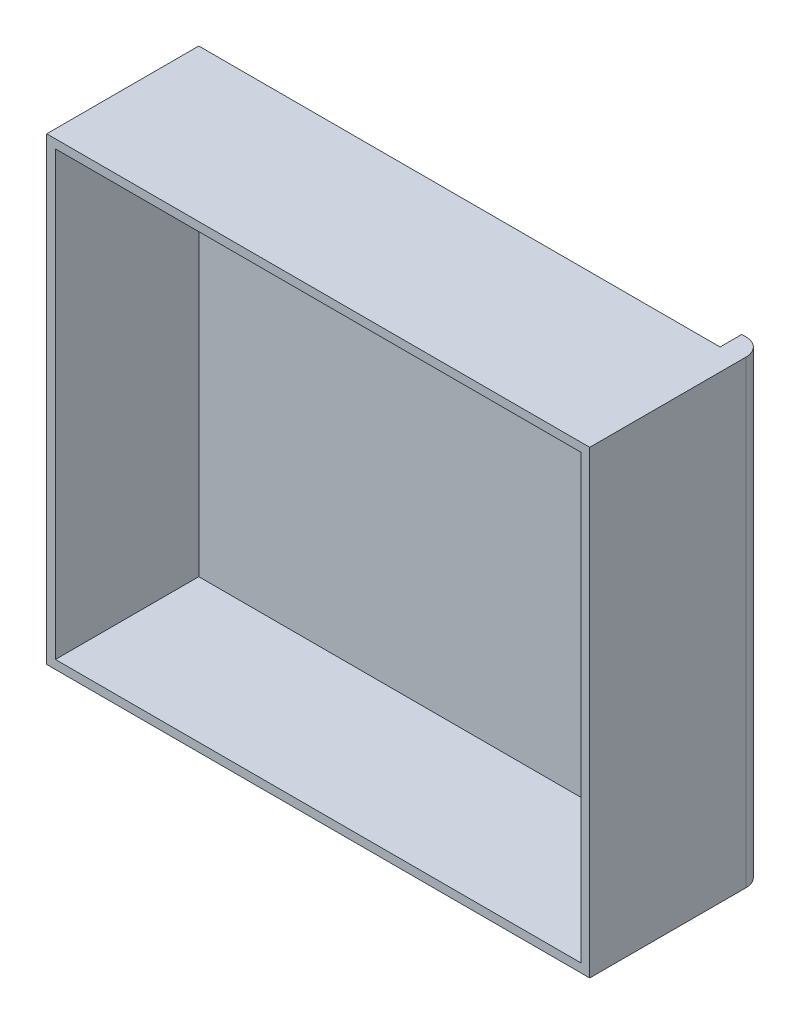
ISO-10303-21;
HEADER;
FILE_DESCRIPTION(('STEP AP214'),'2;1');
FILE_NAME('part.step','',(''),(''),'','','');
FILE_SCHEMA(('AUTOMOTIVE_DESIGN { 1 0 10303 214 1 1 1 1 }'));
ENDSEC;
DATA;
#1=APPLICATION_CONTEXT('core data for automotive mechanical design processes');
#2=APPLICATION_PROTOCOL_DEFINITION('international standard','automotive_design',2000,#1);
#3=PRODUCT_CONTEXT('',#1,'mechanical');
#4=PRODUCT('Part','Part','',(#3));
#5=PRODUCT_RELATED_PRODUCT_CATEGORY('part','',(#4));
#6=PRODUCT_DEFINITION_FORMATION('','',#4);
#7=PRODUCT_DEFINITION_CONTEXT('part definition',#1,'design');
#8=PRODUCT_DEFINITION('design','',#6,#7);
#9=PRODUCT_DEFINITION_SHAPE('','',#8);
#10=(LENGTH_UNIT() NAMED_UNIT(*) SI_UNIT(.MILLI.,.METRE.));
#11=(NAMED_UNIT(*) PLANE_ANGLE_UNIT() SI_UNIT($,.RADIAN.));
#12=(NAMED_UNIT(*) SI_UNIT($,.STERADIAN.) SOLID_ANGLE_UNIT());
#13=UNCERTAINTY_MEASURE_WITH_UNIT(LENGTH_MEASURE(1.E-05),#10,'distance_accuracy_value','');
#14=(GEOMETRIC_REPRESENTATION_CONTEXT(3) GLOBAL_UNCERTAINTY_ASSIGNED_CONTEXT((#13)) GLOBAL_UNIT_ASSIGNED_CONTEXT((#10,
#11,#12)) REPRESENTATION_CONTEXT('',''));
#15=CARTESIAN_POINT('',(0.,0.,0.));
#16=DIRECTION('',(0.,0.,1.));
#17=DIRECTION('',(1.,0.,0.));
#18=AXIS2_PLACEMENT_3D('',#15,#16,#17);
#19=CARTESIAN_POINT('',(0.,0.,35.));
#20=DIRECTION('',(0.,0.,-1.));
#21=DIRECTION('',(-1.,0.,0.));
#22=AXIS2_PLACEMENT_3D('',#19,#20,#21);
#23=PLANE('',#22);
#24=DIRECTION('',(0.,-1.,0.));
#25=VECTOR('',#24,1.);
#26=CARTESIAN_POINT('',(0.,0.,35.));
#27=LINE('',#26,#25);
#28=CARTESIAN_POINT('',(0.,105.8,35.));
#29=VERTEX_POINT('',#28);
#30=CARTESIAN_POINT('',(0.,0.,35.));
#31=VERTEX_POINT('',#30);
#32=EDGE_CURVE('E176',#29,#31,#27,.T.);
#33=ORIENTED_EDGE('',*,*,#32,.T.);
#34=DIRECTION('',(1.,0.,0.));
#35=VECTOR('',#34,1.);
#36=CARTESIAN_POINT('',(0.,0.,35.));
#37=LINE('',#36,#35);
#38=CARTESIAN_POINT('',(125.,0.,35.));
#39=VERTEX_POINT('',#38);
#40=EDGE_CURVE('E179',#31,#39,#37,.T.);
#41=ORIENTED_EDGE('',*,*,#40,.T.);
#42=DIRECTION('',(0.,1.,0.));
#43=VECTOR('',#42,1.);
#44=CARTESIAN_POINT('',(125.,0.,35.));
#45=LINE('',#44,#43);
#46=CARTESIAN_POINT('',(125.,105.8,35.));
#47=VERTEX_POINT('',#46);
#48=EDGE_CURVE('E182',#39,#47,#45,.T.);
#49=ORIENTED_EDGE('',*,*,#48,.T.);
#50=DIRECTION('',(-1.,0.,0.));
#51=VECTOR('',#50,1.);
#52=CARTESIAN_POINT('',(0.,105.8,35.));
#53=LINE('',#52,#51);
#54=EDGE_CURVE('E184',#47,#29,#53,.T.);
#55=ORIENTED_EDGE('',*,*,#54,.T.);
#56=EDGE_LOOP('',(#33,#41,#49,#55));
#57=FACE_BOUND('',#56,.T.);
#58=DIRECTION('',(0.,-1.,0.));
#59=VECTOR('',#58,1.);
#60=CARTESIAN_POINT('',(2.,0.,35.));
#61=LINE('',#60,#59);
#62=CARTESIAN_POINT('',(2.,103.8,35.));
#63=VERTEX_POINT('',#62);
#64=CARTESIAN_POINT('',(2.,2.,35.));
#65=VERTEX_POINT('',#64);
#66=EDGE_CURVE('E168',#63,#65,#61,.T.);
#67=ORIENTED_EDGE('',*,*,#66,.F.);
#68=DIRECTION('',(-1.,0.,0.));
#69=VECTOR('',#68,1.);
#70=CARTESIAN_POINT('',(0.,103.8,35.));
#71=LINE('',#70,#69);
#72=CARTESIAN_POINT('',(123.,103.8,35.));
#73=VERTEX_POINT('',#72);
#74=EDGE_CURVE('E158',#73,#63,#71,.T.);
#75=ORIENTED_EDGE('',*,*,#74,.F.);
#76=DIRECTION('',(0.,1.,0.));
#77=VECTOR('',#76,1.);
#78=CARTESIAN_POINT('',(123.,0.,35.));
#79=LINE('',#78,#77);
#80=CARTESIAN_POINT('',(123.,2.,35.));
#81=VERTEX_POINT('',#80);
#82=EDGE_CURVE('E172',#81,#73,#79,.T.);
#83=ORIENTED_EDGE('',*,*,#82,.F.);
#84=DIRECTION('',(1.,0.,0.));
#85=VECTOR('',#84,1.);
#86=CARTESIAN_POINT('',(0.,2.,35.));
#87=LINE('',#86,#85);
#88=EDGE_CURVE('E170',#65,#81,#87,.T.);
#89=ORIENTED_EDGE('',*,*,#88,.F.);
#90=EDGE_LOOP('',(#67,#75,#83,#89));
#91=FACE_BOUND('',#90,.T.);
#92=ADVANCED_FACE('F33',(#57,#91),#23,.F.);
#93=CARTESIAN_POINT('',(0.,0.,35.));
#94=DIRECTION('',(1.,0.,0.));
#95=DIRECTION('',(0.,0.,-1.));
#96=AXIS2_PLACEMENT_3D('',#93,#94,#95);
#97=PLANE('',#96);
#98=DIRECTION('',(0.,-1.,0.));
#99=VECTOR('',#98,1.);
#100=CARTESIAN_POINT('',(0.,0.,0.));
#101=LINE('',#100,#99);
#102=CARTESIAN_POINT('',(0.,105.8,0.));
#103=VERTEX_POINT('',#102);
#104=CARTESIAN_POINT('',(0.,0.,0.));
#105=VERTEX_POINT('',#104);
#106=EDGE_CURVE('E152',#103,#105,#101,.T.);
#107=ORIENTED_EDGE('',*,*,#106,.T.);
#108=DIRECTION('',(0.,0.,-1.));
#109=VECTOR('',#108,1.);
#110=CARTESIAN_POINT('',(0.,0.,35.));
#111=LINE('',#110,#109);
#112=EDGE_CURVE('E197',#31,#105,#111,.T.);
#113=ORIENTED_EDGE('',*,*,#112,.F.);
#114=ORIENTED_EDGE('',*,*,#32,.F.);
#115=DIRECTION('',(0.,0.,-1.));
#116=VECTOR('',#115,1.);
#117=CARTESIAN_POINT('',(0.,105.8,35.));
#118=LINE('',#117,#116);
#119=EDGE_CURVE('E186',#29,#103,#118,.T.);
#120=ORIENTED_EDGE('',*,*,#119,.T.);
#121=EDGE_LOOP('',(#107,#113,#114,#120));
#122=FACE_BOUND('',#121,.T.);
#123=ADVANCED_FACE('F204',(#122),#97,.F.);
#124=CARTESIAN_POINT('',(0.,0.,35.));
#125=DIRECTION('',(0.,1.,0.));
#126=DIRECTION('',(0.,0.,1.));
#127=AXIS2_PLACEMENT_3D('',#124,#125,#126);
#128=PLANE('',#127);
#129=DIRECTION('',(-1.,0.,0.));
#130=VECTOR('',#129,1.);
#131=CARTESIAN_POINT('',(125.,0.,-5.));
#132=LINE('',#131,#130);
#133=CARTESIAN_POINT('',(121.,0.,-5.));
#134=VERTEX_POINT('',#133);
#135=CARTESIAN_POINT('',(120.,0.,-5.));
#136=VERTEX_POINT('',#135);
#137=EDGE_CURVE('E115',#134,#136,#132,.T.);
#138=ORIENTED_EDGE('',*,*,#137,.F.);
#139=CARTESIAN_POINT('',(121.,0.,-1.));
#140=DIRECTION('',(0.,1.,0.));
#141=DIRECTION('',(0.,0.,1.));
#142=AXIS2_PLACEMENT_3D('',#139,#140,#141);
#143=CIRCLE('',#142,4.);
#144=CARTESIAN_POINT('',(125.,0.,-1.));
#145=VERTEX_POINT('',#144);
#146=EDGE_CURVE('E55',#134,#145,#143,.F.);
#147=ORIENTED_EDGE('',*,*,#146,.T.);
#148=DIRECTION('',(0.,0.,-1.));
#149=VECTOR('',#148,1.);
#150=CARTESIAN_POINT('',(125.,0.,35.));
#151=LINE('',#150,#149);
#152=EDGE_CURVE('E195',#39,#145,#151,.T.);
#153=ORIENTED_EDGE('',*,*,#152,.F.);
#154=ORIENTED_EDGE('',*,*,#40,.F.);
#155=ORIENTED_EDGE('',*,*,#112,.T.);
#156=DIRECTION('',(1.,0.,0.));
#157=VECTOR('',#156,1.);
#158=CARTESIAN_POINT('',(0.,0.,0.));
#159=LINE('',#158,#157);
#160=CARTESIAN_POINT('',(120.,0.,0.));
#161=VERTEX_POINT('',#160);
#162=EDGE_CURVE('E131',#105,#161,#159,.T.);
#163=ORIENTED_EDGE('',*,*,#162,.T.);
#164=DIRECTION('',(0.,0.,1.));
#165=VECTOR('',#164,1.);
#166=CARTESIAN_POINT('',(120.,0.,-5.));
#167=LINE('',#166,#165);
#168=EDGE_CURVE('E128',#136,#161,#167,.T.);
#169=ORIENTED_EDGE('',*,*,#168,.F.);
#170=EDGE_LOOP('',(#138,#147,#153,#154,#155,#163,#169));
#171=FACE_BOUND('',#170,.T.);
#172=ADVANCED_FACE('F129',(#171),#128,.F.);
#173=CARTESIAN_POINT('',(125.,0.,35.));
#174=DIRECTION('',(-1.,0.,0.));
#175=DIRECTION('',(0.,0.,1.));
#176=AXIS2_PLACEMENT_3D('',#173,#174,#175);
#177=PLANE('',#176);
#178=ORIENTED_EDGE('',*,*,#152,.T.);
#179=DIRECTION('',(0.,-1.,0.));
#180=VECTOR('',#179,1.);
#181=CARTESIAN_POINT('',(125.,105.8,-1.));
#182=LINE('',#181,#180);
#183=CARTESIAN_POINT('',(125.,105.8,-1.));
#184=VERTEX_POINT('',#183);
#185=EDGE_CURVE('E41',#145,#184,#182,.F.);
#186=ORIENTED_EDGE('',*,*,#185,.T.);
#187=DIRECTION('',(0.,0.,-1.));
#188=VECTOR('',#187,1.);
#189=CARTESIAN_POINT('',(125.,105.8,35.));
#190=LINE('',#189,#188);
#191=EDGE_CURVE('E193',#47,#184,#190,.T.);
#192=ORIENTED_EDGE('',*,*,#191,.F.);
#193=ORIENTED_EDGE('',*,*,#48,.F.);
#194=EDGE_LOOP('',(#178,#186,#192,#193));
#195=FACE_BOUND('',#194,.T.);
#196=ADVANCED_FACE('F233',(#195),#177,.F.);
#197=CARTESIAN_POINT('',(0.,105.8,35.));
#198=DIRECTION('',(0.,-1.,0.));
#199=DIRECTION('',(0.,0.,-1.));
#200=AXIS2_PLACEMENT_3D('',#197,#198,#199);
#201=PLANE('',#200);
#202=ORIENTED_EDGE('',*,*,#191,.T.);
#203=CARTESIAN_POINT('',(121.,105.8,-1.));
#204=DIRECTION('',(0.,-1.,0.));
#205=DIRECTION('',(0.,0.,-1.));
#206=AXIS2_PLACEMENT_3D('',#203,#204,#205);
#207=CIRCLE('',#206,4.);
#208=CARTESIAN_POINT('',(121.,105.8,-5.));
#209=VERTEX_POINT('',#208);
#210=EDGE_CURVE('E11',#184,#209,#207,.F.);
#211=ORIENTED_EDGE('',*,*,#210,.T.);
#212=DIRECTION('',(1.,0.,0.));
#213=VECTOR('',#212,1.);
#214=CARTESIAN_POINT('',(125.,105.8,-5.));
#215=LINE('',#214,#213);
#216=CARTESIAN_POINT('',(120.,105.8,-5.));
#217=VERTEX_POINT('',#216);
#218=EDGE_CURVE('E140',#217,#209,#215,.T.);
#219=ORIENTED_EDGE('',*,*,#218,.F.);
#220=DIRECTION('',(0.,0.,1.));
#221=VECTOR('',#220,1.);
#222=CARTESIAN_POINT('',(120.,105.8,-5.));
#223=LINE('',#222,#221);
#224=CARTESIAN_POINT('',(120.,105.8,0.));
#225=VERTEX_POINT('',#224);
#226=EDGE_CURVE('E135',#217,#225,#223,.T.);
#227=ORIENTED_EDGE('',*,*,#226,.T.);
#228=DIRECTION('',(-1.,0.,0.));
#229=VECTOR('',#228,1.);
#230=CARTESIAN_POINT('',(0.,105.8,0.));
#231=LINE('',#230,#229);
#232=EDGE_CURVE('E180',#225,#103,#231,.T.);
#233=ORIENTED_EDGE('',*,*,#232,.T.);
#234=ORIENTED_EDGE('',*,*,#119,.F.);
#235=ORIENTED_EDGE('',*,*,#54,.F.);
#236=EDGE_LOOP('',(#202,#211,#219,#227,#233,#234,#235));
#237=FACE_BOUND('',#236,.T.);
#238=ADVANCED_FACE('F209',(#237),#201,.F.);
#239=CARTESIAN_POINT('',(0.,0.,0.));
#240=DIRECTION('',(0.,0.,-1.));
#241=DIRECTION('',(-1.,0.,0.));
#242=AXIS2_PLACEMENT_3D('',#239,#240,#241);
#243=PLANE('',#242);
#244=DIRECTION('',(0.,1.,0.));
#245=VECTOR('',#244,1.);
#246=CARTESIAN_POINT('',(120.,105.8,0.));
#247=LINE('',#246,#245);
#248=EDGE_CURVE('E124',#161,#225,#247,.T.);
#249=ORIENTED_EDGE('',*,*,#248,.F.);
#250=ORIENTED_EDGE('',*,*,#162,.F.);
#251=ORIENTED_EDGE('',*,*,#106,.F.);
#252=ORIENTED_EDGE('',*,*,#232,.F.);
#253=EDGE_LOOP('',(#249,#250,#251,#252));
#254=FACE_BOUND('',#253,.T.);
#255=ADVANCED_FACE('F207',(#254),#243,.T.);
#256=CARTESIAN_POINT('',(2.,0.,35.));
#257=DIRECTION('',(1.,0.,0.));
#258=DIRECTION('',(0.,0.,-1.));
#259=AXIS2_PLACEMENT_3D('',#256,#257,#258);
#260=PLANE('',#259);
#261=DIRECTION('',(0.,-1.,0.));
#262=VECTOR('',#261,1.);
#263=CARTESIAN_POINT('',(2.,0.,2.));
#264=LINE('',#263,#262);
#265=CARTESIAN_POINT('',(2.,103.8,2.));
#266=VERTEX_POINT('',#265);
#267=CARTESIAN_POINT('',(2.,2.,2.));
#268=VERTEX_POINT('',#267);
#269=EDGE_CURVE('E134',#266,#268,#264,.T.);
#270=ORIENTED_EDGE('',*,*,#269,.F.);
#271=DIRECTION('',(0.,0.,-1.));
#272=VECTOR('',#271,1.);
#273=CARTESIAN_POINT('',(2.,103.8,35.));
#274=LINE('',#273,#272);
#275=EDGE_CURVE('E154',#63,#266,#274,.T.);
#276=ORIENTED_EDGE('',*,*,#275,.F.);
#277=ORIENTED_EDGE('',*,*,#66,.T.);
#278=DIRECTION('',(0.,0.,-1.));
#279=VECTOR('',#278,1.);
#280=CARTESIAN_POINT('',(2.,2.,35.));
#281=LINE('',#280,#279);
#282=EDGE_CURVE('E149',#65,#268,#281,.T.);
#283=ORIENTED_EDGE('',*,*,#282,.T.);
#284=EDGE_LOOP('',(#270,#276,#277,#283));
#285=FACE_BOUND('',#284,.T.);
#286=ADVANCED_FACE('F230',(#285),#260,.T.);
#287=CARTESIAN_POINT('',(0.,2.,35.));
#288=DIRECTION('',(0.,1.,0.));
#289=DIRECTION('',(0.,0.,1.));
#290=AXIS2_PLACEMENT_3D('',#287,#288,#289);
#291=PLANE('',#290);
#292=DIRECTION('',(1.,0.,0.));
#293=VECTOR('',#292,1.);
#294=CARTESIAN_POINT('',(0.,2.,2.));
#295=LINE('',#294,#293);
#296=CARTESIAN_POINT('',(123.,2.,2.));
#297=VERTEX_POINT('',#296);
#298=EDGE_CURVE('E148',#268,#297,#295,.T.);
#299=ORIENTED_EDGE('',*,*,#298,.F.);
#300=ORIENTED_EDGE('',*,*,#282,.F.);
#301=ORIENTED_EDGE('',*,*,#88,.T.);
#302=DIRECTION('',(0.,0.,-1.));
#303=VECTOR('',#302,1.);
#304=CARTESIAN_POINT('',(123.,2.,35.));
#305=LINE('',#304,#303);
#306=EDGE_CURVE('E153',#81,#297,#305,.T.);
#307=ORIENTED_EDGE('',*,*,#306,.T.);
#308=EDGE_LOOP('',(#299,#300,#301,#307));
#309=FACE_BOUND('',#308,.T.);
#310=ADVANCED_FACE('F262',(#309),#291,.T.);
#311=CARTESIAN_POINT('',(123.,0.,35.));
#312=DIRECTION('',(-1.,0.,0.));
#313=DIRECTION('',(0.,0.,1.));
#314=AXIS2_PLACEMENT_3D('',#311,#312,#313);
#315=PLANE('',#314);
#316=DIRECTION('',(0.,1.,0.));
#317=VECTOR('',#316,1.);
#318=CARTESIAN_POINT('',(123.,0.,2.));
#319=LINE('',#318,#317);
#320=CARTESIAN_POINT('',(123.,103.8,2.));
#321=VERTEX_POINT('',#320);
#322=EDGE_CURVE('E160',#297,#321,#319,.T.);
#323=ORIENTED_EDGE('',*,*,#322,.F.);
#324=ORIENTED_EDGE('',*,*,#306,.F.);
#325=ORIENTED_EDGE('',*,*,#82,.T.);
#326=DIRECTION('',(0.,0.,-1.));
#327=VECTOR('',#326,1.);
#328=CARTESIAN_POINT('',(123.,103.8,35.));
#329=LINE('',#328,#327);
#330=EDGE_CURVE('E157',#73,#321,#329,.T.);
#331=ORIENTED_EDGE('',*,*,#330,.T.);
#332=EDGE_LOOP('',(#323,#324,#325,#331));
#333=FACE_BOUND('',#332,.T.);
#334=ADVANCED_FACE('F270',(#333),#315,.T.);
#335=CARTESIAN_POINT('',(0.,103.8,35.));
#336=DIRECTION('',(0.,-1.,0.));
#337=DIRECTION('',(0.,0.,-1.));
#338=AXIS2_PLACEMENT_3D('',#335,#336,#337);
#339=PLANE('',#338);
#340=DIRECTION('',(-1.,0.,0.));
#341=VECTOR('',#340,1.);
#342=CARTESIAN_POINT('',(0.,103.8,2.));
#343=LINE('',#342,#341);
#344=EDGE_CURVE('E164',#321,#266,#343,.T.);
#345=ORIENTED_EDGE('',*,*,#344,.F.);
#346=ORIENTED_EDGE('',*,*,#330,.F.);
#347=ORIENTED_EDGE('',*,*,#74,.T.);
#348=ORIENTED_EDGE('',*,*,#275,.T.);
#349=EDGE_LOOP('',(#345,#346,#347,#348));
#350=FACE_BOUND('',#349,.T.);
#351=ADVANCED_FACE('F278',(#350),#339,.T.);
#352=CARTESIAN_POINT('',(0.,0.,2.));
#353=DIRECTION('',(0.,0.,-1.));
#354=DIRECTION('',(-1.,0.,0.));
#355=AXIS2_PLACEMENT_3D('',#352,#353,#354);
#356=PLANE('',#355);
#357=ORIENTED_EDGE('',*,*,#269,.T.);
#358=ORIENTED_EDGE('',*,*,#298,.T.);
#359=ORIENTED_EDGE('',*,*,#322,.T.);
#360=ORIENTED_EDGE('',*,*,#344,.T.);
#361=EDGE_LOOP('',(#357,#358,#359,#360));
#362=FACE_BOUND('',#361,.T.);
#363=ADVANCED_FACE('F226',(#362),#356,.F.);
#364=CARTESIAN_POINT('',(120.,105.8,-5.));
#365=DIRECTION('',(1.,0.,0.));
#366=DIRECTION('',(0.,1.,0.));
#367=AXIS2_PLACEMENT_3D('',#364,#365,#366);
#368=PLANE('',#367);
#369=ORIENTED_EDGE('',*,*,#248,.T.);
#370=ORIENTED_EDGE('',*,*,#226,.F.);
#371=DIRECTION('',(0.,1.,0.));
#372=VECTOR('',#371,1.);
#373=CARTESIAN_POINT('',(120.,105.8,-5.));
#374=LINE('',#373,#372);
#375=EDGE_CURVE('E120',#136,#217,#374,.T.);
#376=ORIENTED_EDGE('',*,*,#375,.F.);
#377=ORIENTED_EDGE('',*,*,#168,.T.);
#378=EDGE_LOOP('',(#369,#370,#376,#377));
#379=FACE_BOUND('',#378,.T.);
#380=ADVANCED_FACE('F137',(#379),#368,.F.);
#381=CARTESIAN_POINT('',(0.,0.,-5.));
#382=DIRECTION('',(0.,0.,-1.));
#383=DIRECTION('',(-1.,0.,0.));
#384=AXIS2_PLACEMENT_3D('',#381,#382,#383);
#385=PLANE('',#384);
#386=ORIENTED_EDGE('',*,*,#218,.T.);
#387=DIRECTION('',(0.,-1.,0.));
#388=VECTOR('',#387,1.);
#389=CARTESIAN_POINT('',(121.,0.,-5.));
#390=LINE('',#389,#388);
#391=EDGE_CURVE('E123',#209,#134,#390,.T.);
#392=ORIENTED_EDGE('',*,*,#391,.T.);
#393=ORIENTED_EDGE('',*,*,#137,.T.);
#394=ORIENTED_EDGE('',*,*,#375,.T.);
#395=EDGE_LOOP('',(#386,#392,#393,#394));
#396=FACE_BOUND('',#395,.T.);
#397=ADVANCED_FACE('F118',(#396),#385,.T.);
#398=CARTESIAN_POINT('',(121.,0.,-1.));
#399=DIRECTION('',(0.,1.,0.));
#400=DIRECTION('',(0.,0.,1.));
#401=AXIS2_PLACEMENT_3D('',#398,#399,#400);
#402=CYLINDRICAL_SURFACE('',#401,4.);
#403=ORIENTED_EDGE('',*,*,#210,.F.);
#404=ORIENTED_EDGE('',*,*,#185,.F.);
#405=ORIENTED_EDGE('',*,*,#146,.F.);
#406=ORIENTED_EDGE('',*,*,#391,.F.);
#407=EDGE_LOOP('',(#403,#404,#405,#406));
#408=FACE_BOUND('',#407,.T.);
#409=ADVANCED_FACE('F35',(#408),#402,.T.);
#410=CLOSED_SHELL('',(#92,#123,#172,#196,#238,#255,#286,#310,#334,#351,#363,#380,#397,#409));
#411=MANIFOLD_SOLID_BREP('B2',#410);
#412=ADVANCED_BREP_SHAPE_REPRESENTATION('',(#18,#411),#14);
#413=SHAPE_DEFINITION_REPRESENTATION(#9,#412);
ENDSEC;
END-ISO-10303-21;
